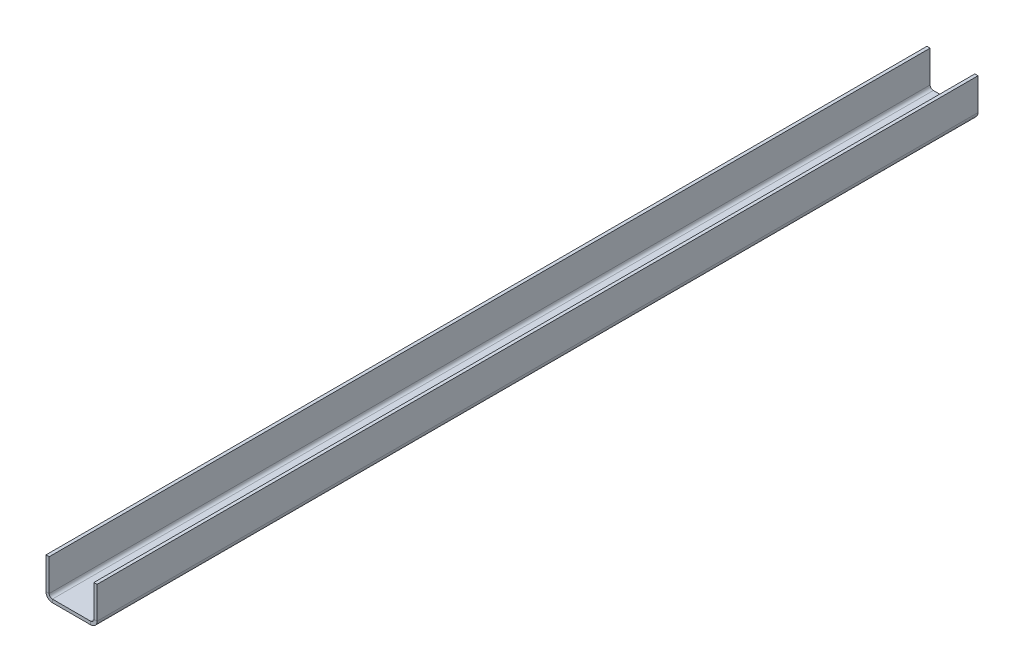
ISO-10303-21;
HEADER;
FILE_DESCRIPTION(('STEP AP214'),'2;1');
FILE_NAME('part.step','',(''),(''),'','','');
FILE_SCHEMA(('AUTOMOTIVE_DESIGN { 1 0 10303 214 1 1 1 1 }'));
ENDSEC;
DATA;
#1=APPLICATION_CONTEXT('core data for automotive mechanical design processes');
#2=APPLICATION_PROTOCOL_DEFINITION('international standard','automotive_design',2000,#1);
#3=PRODUCT_CONTEXT('',#1,'mechanical');
#4=PRODUCT('Part','Part','',(#3));
#5=PRODUCT_RELATED_PRODUCT_CATEGORY('part','',(#4));
#6=PRODUCT_DEFINITION_FORMATION('','',#4);
#7=PRODUCT_DEFINITION_CONTEXT('part definition',#1,'design');
#8=PRODUCT_DEFINITION('design','',#6,#7);
#9=PRODUCT_DEFINITION_SHAPE('','',#8);
#10=(LENGTH_UNIT() NAMED_UNIT(*) SI_UNIT(.MILLI.,.METRE.));
#11=(NAMED_UNIT(*) PLANE_ANGLE_UNIT() SI_UNIT($,.RADIAN.));
#12=(NAMED_UNIT(*) SI_UNIT($,.STERADIAN.) SOLID_ANGLE_UNIT());
#13=UNCERTAINTY_MEASURE_WITH_UNIT(LENGTH_MEASURE(1.E-05),#10,'distance_accuracy_value','');
#14=(GEOMETRIC_REPRESENTATION_CONTEXT(3) GLOBAL_UNCERTAINTY_ASSIGNED_CONTEXT((#13)) GLOBAL_UNIT_ASSIGNED_CONTEXT((#10,
#11,#12)) REPRESENTATION_CONTEXT('',''));
#15=CARTESIAN_POINT('',(0.,0.,0.));
#16=DIRECTION('',(0.,0.,1.));
#17=DIRECTION('',(1.,0.,0.));
#18=AXIS2_PLACEMENT_3D('',#15,#16,#17);
#19=CARTESIAN_POINT('',(0.,6.35,876.3));
#20=DIRECTION('',(0.,0.,1.));
#21=DIRECTION('',(1.,0.,0.));
#22=AXIS2_PLACEMENT_3D('',#19,#20,#21);
#23=PLANE('',#22);
#24=DIRECTION('',(1.,0.,0.));
#25=VECTOR('',#24,1.);
#26=CARTESIAN_POINT('',(0.,6.35,876.3));
#27=LINE('',#26,#25);
#28=CARTESIAN_POINT('',(0.,6.35,876.3));
#29=VERTEX_POINT('',#28);
#30=CARTESIAN_POINT('',(3.175,6.35,876.3));
#31=VERTEX_POINT('',#30);
#32=EDGE_CURVE('E11',#29,#31,#27,.T.);
#33=ORIENTED_EDGE('',*,*,#32,.F.);
#34=CARTESIAN_POINT('',(6.35,6.35,876.3));
#35=DIRECTION('',(0.,0.,-1.));
#36=DIRECTION('',(-1.,0.,0.));
#37=AXIS2_PLACEMENT_3D('',#34,#35,#36);
#38=CIRCLE('',#37,6.35);
#39=CARTESIAN_POINT('',(6.35,0.,876.3));
#40=VERTEX_POINT('',#39);
#41=EDGE_CURVE('E147',#29,#40,#38,.F.);
#42=ORIENTED_EDGE('',*,*,#41,.T.);
#43=DIRECTION('',(0.,-1.,0.));
#44=VECTOR('',#43,1.);
#45=CARTESIAN_POINT('',(6.35,3.175,876.3));
#46=LINE('',#45,#44);
#47=CARTESIAN_POINT('',(6.35,3.175,876.3));
#48=VERTEX_POINT('',#47);
#49=EDGE_CURVE('E45',#48,#40,#46,.T.);
#50=ORIENTED_EDGE('',*,*,#49,.F.);
#51=CARTESIAN_POINT('',(6.35,6.35,876.3));
#52=DIRECTION('',(0.,0.,1.));
#53=DIRECTION('',(1.,0.,0.));
#54=AXIS2_PLACEMENT_3D('',#51,#52,#53);
#55=CIRCLE('',#54,3.175);
#56=EDGE_CURVE('E241',#31,#48,#55,.T.);
#57=ORIENTED_EDGE('',*,*,#56,.F.);
#58=EDGE_LOOP('',(#33,#42,#50,#57));
#59=FACE_BOUND('',#58,.T.);
#60=ADVANCED_FACE('F37',(#59),#23,.T.);
#61=CARTESIAN_POINT('',(6.35,3.175,876.3));
#62=DIRECTION('',(0.,0.,1.));
#63=DIRECTION('',(1.,0.,0.));
#64=AXIS2_PLACEMENT_3D('',#61,#62,#63);
#65=PLANE('',#64);
#66=DIRECTION('',(0.,-1.,0.));
#67=VECTOR('',#66,1.);
#68=CARTESIAN_POINT('',(0.,0.,876.3));
#69=LINE('',#68,#67);
#70=CARTESIAN_POINT('',(0.,38.1,876.3));
#71=VERTEX_POINT('',#70);
#72=EDGE_CURVE('E152',#71,#29,#69,.T.);
#73=ORIENTED_EDGE('',*,*,#72,.T.);
#74=ORIENTED_EDGE('',*,*,#32,.T.);
#75=DIRECTION('',(0.,1.,0.));
#76=VECTOR('',#75,1.);
#77=CARTESIAN_POINT('',(3.175,0.,876.3));
#78=LINE('',#77,#76);
#79=CARTESIAN_POINT('',(3.175,38.1,876.3));
#80=VERTEX_POINT('',#79);
#81=EDGE_CURVE('E254',#80,#31,#78,.F.);
#82=ORIENTED_EDGE('',*,*,#81,.F.);
#83=DIRECTION('',(1.,0.,0.));
#84=VECTOR('',#83,1.);
#85=CARTESIAN_POINT('',(0.,38.1,876.3));
#86=LINE('',#85,#84);
#87=EDGE_CURVE('E256',#71,#80,#86,.T.);
#88=ORIENTED_EDGE('',*,*,#87,.F.);
#89=EDGE_LOOP('',(#73,#74,#82,#88));
#90=FACE_BOUND('',#89,.T.);
#91=ADVANCED_FACE('F267',(#90),#65,.T.);
#92=CARTESIAN_POINT('',(6.35,0.,0.));
#93=DIRECTION('',(0.,0.,-1.));
#94=DIRECTION('',(-1.,0.,0.));
#95=AXIS2_PLACEMENT_3D('',#92,#93,#94);
#96=PLANE('',#95);
#97=DIRECTION('',(0.,1.,0.));
#98=VECTOR('',#97,1.);
#99=CARTESIAN_POINT('',(6.35,0.,0.));
#100=LINE('',#99,#98);
#101=CARTESIAN_POINT('',(6.35,0.,0.));
#102=VERTEX_POINT('',#101);
#103=CARTESIAN_POINT('',(6.35,3.175,0.));
#104=VERTEX_POINT('',#103);
#105=EDGE_CURVE('E145',#102,#104,#100,.T.);
#106=ORIENTED_EDGE('',*,*,#105,.F.);
#107=CARTESIAN_POINT('',(6.35,6.35,0.));
#108=DIRECTION('',(0.,0.,-1.));
#109=DIRECTION('',(-1.,0.,0.));
#110=AXIS2_PLACEMENT_3D('',#107,#108,#109);
#111=CIRCLE('',#110,6.35);
#112=CARTESIAN_POINT('',(0.,6.35,0.));
#113=VERTEX_POINT('',#112);
#114=EDGE_CURVE('E159',#113,#102,#111,.F.);
#115=ORIENTED_EDGE('',*,*,#114,.F.);
#116=DIRECTION('',(-1.,0.,0.));
#117=VECTOR('',#116,1.);
#118=CARTESIAN_POINT('',(3.175,6.35,0.));
#119=LINE('',#118,#117);
#120=CARTESIAN_POINT('',(3.175,6.35,0.));
#121=VERTEX_POINT('',#120);
#122=EDGE_CURVE('E232',#121,#113,#119,.T.);
#123=ORIENTED_EDGE('',*,*,#122,.F.);
#124=CARTESIAN_POINT('',(6.35,6.35,0.));
#125=DIRECTION('',(0.,0.,1.));
#126=DIRECTION('',(1.,0.,0.));
#127=AXIS2_PLACEMENT_3D('',#124,#125,#126);
#128=CIRCLE('',#127,3.175);
#129=EDGE_CURVE('E186',#121,#104,#128,.T.);
#130=ORIENTED_EDGE('',*,*,#129,.T.);
#131=EDGE_LOOP('',(#106,#115,#123,#130));
#132=FACE_BOUND('',#131,.T.);
#133=ADVANCED_FACE('F246',(#132),#96,.T.);
#134=CARTESIAN_POINT('',(3.175,6.35,0.));
#135=DIRECTION('',(0.,0.,-1.));
#136=DIRECTION('',(-1.,0.,0.));
#137=AXIS2_PLACEMENT_3D('',#134,#135,#136);
#138=PLANE('',#137);
#139=DIRECTION('',(1.,0.,0.));
#140=VECTOR('',#139,1.);
#141=CARTESIAN_POINT('',(0.,0.,0.));
#142=LINE('',#141,#140);
#143=CARTESIAN_POINT('',(44.45,0.,0.));
#144=VERTEX_POINT('',#143);
#145=EDGE_CURVE('E199',#102,#144,#142,.T.);
#146=ORIENTED_EDGE('',*,*,#145,.F.);
#147=ORIENTED_EDGE('',*,*,#105,.T.);
#148=DIRECTION('',(1.,0.,0.));
#149=VECTOR('',#148,1.);
#150=CARTESIAN_POINT('',(0.,3.175,0.));
#151=LINE('',#150,#149);
#152=CARTESIAN_POINT('',(44.45,3.175,0.));
#153=VERTEX_POINT('',#152);
#154=EDGE_CURVE('E184',#104,#153,#151,.T.);
#155=ORIENTED_EDGE('',*,*,#154,.T.);
#156=DIRECTION('',(0.,-1.,0.));
#157=VECTOR('',#156,1.);
#158=CARTESIAN_POINT('',(44.45,3.175,0.));
#159=LINE('',#158,#157);
#160=EDGE_CURVE('E94',#153,#144,#159,.T.);
#161=ORIENTED_EDGE('',*,*,#160,.T.);
#162=EDGE_LOOP('',(#146,#147,#155,#161));
#163=FACE_BOUND('',#162,.T.);
#164=ADVANCED_FACE('F234',(#163),#138,.T.);
#165=CARTESIAN_POINT('',(44.45,0.,876.3));
#166=DIRECTION('',(0.,0.,1.));
#167=DIRECTION('',(1.,0.,0.));
#168=AXIS2_PLACEMENT_3D('',#165,#166,#167);
#169=PLANE('',#168);
#170=DIRECTION('',(0.,1.,0.));
#171=VECTOR('',#170,1.);
#172=CARTESIAN_POINT('',(44.45,0.,876.3));
#173=LINE('',#172,#171);
#174=CARTESIAN_POINT('',(44.45,0.,876.3));
#175=VERTEX_POINT('',#174);
#176=CARTESIAN_POINT('',(44.45,3.175,876.3));
#177=VERTEX_POINT('',#176);
#178=EDGE_CURVE('E230',#175,#177,#173,.T.);
#179=ORIENTED_EDGE('',*,*,#178,.F.);
#180=CARTESIAN_POINT('',(44.45,6.35,876.3));
#181=DIRECTION('',(0.,0.,-1.));
#182=DIRECTION('',(-1.,0.,0.));
#183=AXIS2_PLACEMENT_3D('',#180,#181,#182);
#184=CIRCLE('',#183,6.35);
#185=CARTESIAN_POINT('',(50.8,6.35,876.3));
#186=VERTEX_POINT('',#185);
#187=EDGE_CURVE('E167',#175,#186,#184,.F.);
#188=ORIENTED_EDGE('',*,*,#187,.T.);
#189=DIRECTION('',(1.,0.,0.));
#190=VECTOR('',#189,1.);
#191=CARTESIAN_POINT('',(47.625,6.35,876.3));
#192=LINE('',#191,#190);
#193=CARTESIAN_POINT('',(47.625,6.35,876.3));
#194=VERTEX_POINT('',#193);
#195=EDGE_CURVE('E53',#194,#186,#192,.T.);
#196=ORIENTED_EDGE('',*,*,#195,.F.);
#197=CARTESIAN_POINT('',(44.45,6.35,876.3));
#198=DIRECTION('',(0.,0.,1.));
#199=DIRECTION('',(1.,0.,0.));
#200=AXIS2_PLACEMENT_3D('',#197,#198,#199);
#201=CIRCLE('',#200,3.175);
#202=EDGE_CURVE('E258',#177,#194,#201,.T.);
#203=ORIENTED_EDGE('',*,*,#202,.F.);
#204=EDGE_LOOP('',(#179,#188,#196,#203));
#205=FACE_BOUND('',#204,.T.);
#206=ADVANCED_FACE('F293',(#205),#169,.T.);
#207=CARTESIAN_POINT('',(47.625,6.35,876.3));
#208=DIRECTION('',(0.,0.,1.));
#209=DIRECTION('',(1.,0.,0.));
#210=AXIS2_PLACEMENT_3D('',#207,#208,#209);
#211=PLANE('',#210);
#212=DIRECTION('',(1.,0.,0.));
#213=VECTOR('',#212,1.);
#214=CARTESIAN_POINT('',(0.,0.,876.3));
#215=LINE('',#214,#213);
#216=EDGE_CURVE('E137',#40,#175,#215,.T.);
#217=ORIENTED_EDGE('',*,*,#216,.T.);
#218=ORIENTED_EDGE('',*,*,#178,.T.);
#219=DIRECTION('',(1.,0.,0.));
#220=VECTOR('',#219,1.);
#221=CARTESIAN_POINT('',(0.,3.175,876.3));
#222=LINE('',#221,#220);
#223=EDGE_CURVE('E140',#48,#177,#222,.T.);
#224=ORIENTED_EDGE('',*,*,#223,.F.);
#225=ORIENTED_EDGE('',*,*,#49,.T.);
#226=EDGE_LOOP('',(#217,#218,#224,#225));
#227=FACE_BOUND('',#226,.T.);
#228=ADVANCED_FACE('F135',(#227),#211,.T.);
#229=CARTESIAN_POINT('',(50.8,6.35,0.));
#230=DIRECTION('',(0.,0.,-1.));
#231=DIRECTION('',(-1.,0.,0.));
#232=AXIS2_PLACEMENT_3D('',#229,#230,#231);
#233=PLANE('',#232);
#234=DIRECTION('',(-1.,0.,0.));
#235=VECTOR('',#234,1.);
#236=CARTESIAN_POINT('',(50.8,6.35,0.));
#237=LINE('',#236,#235);
#238=CARTESIAN_POINT('',(50.8,6.35,0.));
#239=VERTEX_POINT('',#238);
#240=CARTESIAN_POINT('',(47.625,6.35,0.));
#241=VERTEX_POINT('',#240);
#242=EDGE_CURVE('E101',#239,#241,#237,.T.);
#243=ORIENTED_EDGE('',*,*,#242,.F.);
#244=CARTESIAN_POINT('',(44.45,6.35,0.));
#245=DIRECTION('',(0.,0.,-1.));
#246=DIRECTION('',(-1.,0.,0.));
#247=AXIS2_PLACEMENT_3D('',#244,#245,#246);
#248=CIRCLE('',#247,6.35);
#249=EDGE_CURVE('E201',#144,#239,#248,.F.);
#250=ORIENTED_EDGE('',*,*,#249,.F.);
#251=ORIENTED_EDGE('',*,*,#160,.F.);
#252=CARTESIAN_POINT('',(44.45,6.35,0.));
#253=DIRECTION('',(0.,0.,1.));
#254=DIRECTION('',(1.,0.,0.));
#255=AXIS2_PLACEMENT_3D('',#252,#253,#254);
#256=CIRCLE('',#255,3.175);
#257=EDGE_CURVE('E182',#153,#241,#256,.T.);
#258=ORIENTED_EDGE('',*,*,#257,.T.);
#259=EDGE_LOOP('',(#243,#250,#251,#258));
#260=FACE_BOUND('',#259,.T.);
#261=ADVANCED_FACE('F299',(#260),#233,.T.);
#262=CARTESIAN_POINT('',(44.45,3.175,0.));
#263=DIRECTION('',(0.,0.,-1.));
#264=DIRECTION('',(-1.,0.,0.));
#265=AXIS2_PLACEMENT_3D('',#262,#263,#264);
#266=PLANE('',#265);
#267=DIRECTION('',(0.,1.,0.));
#268=VECTOR('',#267,1.);
#269=CARTESIAN_POINT('',(50.8,0.,0.));
#270=LINE('',#269,#268);
#271=CARTESIAN_POINT('',(50.8,38.1,0.));
#272=VERTEX_POINT('',#271);
#273=EDGE_CURVE('E173',#239,#272,#270,.T.);
#274=ORIENTED_EDGE('',*,*,#273,.F.);
#275=ORIENTED_EDGE('',*,*,#242,.T.);
#276=DIRECTION('',(0.,1.,0.));
#277=VECTOR('',#276,1.);
#278=CARTESIAN_POINT('',(47.625,0.,0.));
#279=LINE('',#278,#277);
#280=CARTESIAN_POINT('',(47.625,38.1,0.));
#281=VERTEX_POINT('',#280);
#282=EDGE_CURVE('E179',#241,#281,#279,.T.);
#283=ORIENTED_EDGE('',*,*,#282,.T.);
#284=DIRECTION('',(1.,0.,0.));
#285=VECTOR('',#284,1.);
#286=CARTESIAN_POINT('',(47.625,38.1,0.));
#287=LINE('',#286,#285);
#288=EDGE_CURVE('E176',#281,#272,#287,.T.);
#289=ORIENTED_EDGE('',*,*,#288,.T.);
#290=EDGE_LOOP('',(#274,#275,#283,#289));
#291=FACE_BOUND('',#290,.T.);
#292=ADVANCED_FACE('F302',(#291),#266,.T.);
#293=CARTESIAN_POINT('',(50.8,0.,876.3));
#294=DIRECTION('',(-1.,0.,0.));
#295=DIRECTION('',(0.,0.,1.));
#296=AXIS2_PLACEMENT_3D('',#293,#294,#295);
#297=PLANE('',#296);
#298=ORIENTED_EDGE('',*,*,#273,.T.);
#299=DIRECTION('',(0.,0.,-1.));
#300=VECTOR('',#299,1.);
#301=CARTESIAN_POINT('',(50.8,38.1,876.3));
#302=LINE('',#301,#300);
#303=CARTESIAN_POINT('',(50.8,38.1,876.3));
#304=VERTEX_POINT('',#303);
#305=EDGE_CURVE('E225',#304,#272,#302,.T.);
#306=ORIENTED_EDGE('',*,*,#305,.F.);
#307=DIRECTION('',(0.,1.,0.));
#308=VECTOR('',#307,1.);
#309=CARTESIAN_POINT('',(50.8,0.,876.3));
#310=LINE('',#309,#308);
#311=EDGE_CURVE('E107',#186,#304,#310,.T.);
#312=ORIENTED_EDGE('',*,*,#311,.F.);
#313=DIRECTION('',(0.,0.,-1.));
#314=VECTOR('',#313,1.);
#315=CARTESIAN_POINT('',(50.8,6.35,876.3));
#316=LINE('',#315,#314);
#317=EDGE_CURVE('E169',#186,#239,#316,.T.);
#318=ORIENTED_EDGE('',*,*,#317,.T.);
#319=EDGE_LOOP('',(#298,#306,#312,#318));
#320=FACE_BOUND('',#319,.T.);
#321=ADVANCED_FACE('F305',(#320),#297,.F.);
#322=CARTESIAN_POINT('',(47.625,38.1,876.3));
#323=DIRECTION('',(0.,1.,0.));
#324=DIRECTION('',(0.,0.,1.));
#325=AXIS2_PLACEMENT_3D('',#322,#323,#324);
#326=PLANE('',#325);
#327=ORIENTED_EDGE('',*,*,#288,.F.);
#328=DIRECTION('',(0.,0.,-1.));
#329=VECTOR('',#328,1.);
#330=CARTESIAN_POINT('',(47.625,38.1,876.3));
#331=LINE('',#330,#329);
#332=CARTESIAN_POINT('',(47.625,38.1,876.3));
#333=VERTEX_POINT('',#332);
#334=EDGE_CURVE('E223',#333,#281,#331,.T.);
#335=ORIENTED_EDGE('',*,*,#334,.F.);
#336=DIRECTION('',(1.,0.,0.));
#337=VECTOR('',#336,1.);
#338=CARTESIAN_POINT('',(47.625,38.1,876.3));
#339=LINE('',#338,#337);
#340=EDGE_CURVE('E513',#333,#304,#339,.T.);
#341=ORIENTED_EDGE('',*,*,#340,.T.);
#342=ORIENTED_EDGE('',*,*,#305,.T.);
#343=EDGE_LOOP('',(#327,#335,#341,#342));
#344=FACE_BOUND('',#343,.T.);
#345=ADVANCED_FACE('F309',(#344),#326,.T.);
#346=CARTESIAN_POINT('',(47.625,0.,876.3));
#347=DIRECTION('',(-1.,0.,0.));
#348=DIRECTION('',(0.,0.,1.));
#349=AXIS2_PLACEMENT_3D('',#346,#347,#348);
#350=PLANE('',#349);
#351=ORIENTED_EDGE('',*,*,#282,.F.);
#352=DIRECTION('',(0.,0.,-1.));
#353=VECTOR('',#352,1.);
#354=CARTESIAN_POINT('',(47.625,6.35,876.3));
#355=LINE('',#354,#353);
#356=EDGE_CURVE('E220',#194,#241,#355,.T.);
#357=ORIENTED_EDGE('',*,*,#356,.F.);
#358=DIRECTION('',(0.,1.,0.));
#359=VECTOR('',#358,1.);
#360=CARTESIAN_POINT('',(47.625,0.,876.3));
#361=LINE('',#360,#359);
#362=EDGE_CURVE('E515',#194,#333,#361,.T.);
#363=ORIENTED_EDGE('',*,*,#362,.T.);
#364=ORIENTED_EDGE('',*,*,#334,.T.);
#365=EDGE_LOOP('',(#351,#357,#363,#364));
#366=FACE_BOUND('',#365,.T.);
#367=ADVANCED_FACE('F313',(#366),#350,.T.);
#368=CARTESIAN_POINT('',(44.45,6.35,876.3));
#369=DIRECTION('',(0.,0.,-1.));
#370=DIRECTION('',(-1.,0.,0.));
#371=AXIS2_PLACEMENT_3D('',#368,#369,#370);
#372=CYLINDRICAL_SURFACE('',#371,3.175);
#373=ORIENTED_EDGE('',*,*,#257,.F.);
#374=DIRECTION('',(0.,0.,-1.));
#375=VECTOR('',#374,1.);
#376=CARTESIAN_POINT('',(44.45,3.175,876.3));
#377=LINE('',#376,#375);
#378=EDGE_CURVE('E217',#177,#153,#377,.T.);
#379=ORIENTED_EDGE('',*,*,#378,.F.);
#380=ORIENTED_EDGE('',*,*,#202,.T.);
#381=ORIENTED_EDGE('',*,*,#356,.T.);
#382=EDGE_LOOP('',(#373,#379,#380,#381));
#383=FACE_BOUND('',#382,.T.);
#384=ADVANCED_FACE('F317',(#383),#372,.F.);
#385=CARTESIAN_POINT('',(0.,3.175,876.3));
#386=DIRECTION('',(0.,1.,0.));
#387=DIRECTION('',(0.,0.,1.));
#388=AXIS2_PLACEMENT_3D('',#385,#386,#387);
#389=PLANE('',#388);
#390=ORIENTED_EDGE('',*,*,#154,.F.);
#391=DIRECTION('',(0.,0.,-1.));
#392=VECTOR('',#391,1.);
#393=CARTESIAN_POINT('',(6.35,3.175,876.3));
#394=LINE('',#393,#392);
#395=EDGE_CURVE('E214',#48,#104,#394,.T.);
#396=ORIENTED_EDGE('',*,*,#395,.F.);
#397=ORIENTED_EDGE('',*,*,#223,.T.);
#398=ORIENTED_EDGE('',*,*,#378,.T.);
#399=EDGE_LOOP('',(#390,#396,#397,#398));
#400=FACE_BOUND('',#399,.T.);
#401=ADVANCED_FACE('F243',(#400),#389,.T.);
#402=CARTESIAN_POINT('',(6.35,6.35,876.3));
#403=DIRECTION('',(0.,0.,-1.));
#404=DIRECTION('',(-1.,0.,0.));
#405=AXIS2_PLACEMENT_3D('',#402,#403,#404);
#406=CYLINDRICAL_SURFACE('',#405,3.175);
#407=ORIENTED_EDGE('',*,*,#129,.F.);
#408=DIRECTION('',(0.,0.,-1.));
#409=VECTOR('',#408,1.);
#410=CARTESIAN_POINT('',(3.175,6.35,876.3));
#411=LINE('',#410,#409);
#412=EDGE_CURVE('E211',#31,#121,#411,.T.);
#413=ORIENTED_EDGE('',*,*,#412,.F.);
#414=ORIENTED_EDGE('',*,*,#56,.T.);
#415=ORIENTED_EDGE('',*,*,#395,.T.);
#416=EDGE_LOOP('',(#407,#413,#414,#415));
#417=FACE_BOUND('',#416,.T.);
#418=ADVANCED_FACE('F239',(#417),#406,.F.);
#419=CARTESIAN_POINT('',(3.175,0.,876.3));
#420=DIRECTION('',(1.,0.,0.));
#421=DIRECTION('',(0.,0.,-1.));
#422=AXIS2_PLACEMENT_3D('',#419,#420,#421);
#423=PLANE('',#422);
#424=DIRECTION('',(0.,1.,0.));
#425=VECTOR('',#424,1.);
#426=CARTESIAN_POINT('',(3.175,0.,0.));
#427=LINE('',#426,#425);
#428=CARTESIAN_POINT('',(3.175,38.1,0.));
#429=VERTEX_POINT('',#428);
#430=EDGE_CURVE('E189',#429,#121,#427,.F.);
#431=ORIENTED_EDGE('',*,*,#430,.F.);
#432=DIRECTION('',(0.,0.,-1.));
#433=VECTOR('',#432,1.);
#434=CARTESIAN_POINT('',(3.175,38.1,876.3));
#435=LINE('',#434,#433);
#436=EDGE_CURVE('E209',#80,#429,#435,.T.);
#437=ORIENTED_EDGE('',*,*,#436,.F.);
#438=ORIENTED_EDGE('',*,*,#81,.T.);
#439=ORIENTED_EDGE('',*,*,#412,.T.);
#440=EDGE_LOOP('',(#431,#437,#438,#439));
#441=FACE_BOUND('',#440,.T.);
#442=ADVANCED_FACE('F252',(#441),#423,.T.);
#443=CARTESIAN_POINT('',(0.,38.1,876.3));
#444=DIRECTION('',(0.,1.,0.));
#445=DIRECTION('',(0.,0.,1.));
#446=AXIS2_PLACEMENT_3D('',#443,#444,#445);
#447=PLANE('',#446);
#448=DIRECTION('',(1.,0.,0.));
#449=VECTOR('',#448,1.);
#450=CARTESIAN_POINT('',(0.,38.1,0.));
#451=LINE('',#450,#449);
#452=CARTESIAN_POINT('',(0.,38.1,0.));
#453=VERTEX_POINT('',#452);
#454=EDGE_CURVE('E192',#453,#429,#451,.T.);
#455=ORIENTED_EDGE('',*,*,#454,.F.);
#456=DIRECTION('',(0.,0.,-1.));
#457=VECTOR('',#456,1.);
#458=CARTESIAN_POINT('',(0.,38.1,876.3));
#459=LINE('',#458,#457);
#460=EDGE_CURVE('E207',#71,#453,#459,.T.);
#461=ORIENTED_EDGE('',*,*,#460,.F.);
#462=ORIENTED_EDGE('',*,*,#87,.T.);
#463=ORIENTED_EDGE('',*,*,#436,.T.);
#464=EDGE_LOOP('',(#455,#461,#462,#463));
#465=FACE_BOUND('',#464,.T.);
#466=ADVANCED_FACE('F273',(#465),#447,.T.);
#467=CARTESIAN_POINT('',(0.,0.,876.3));
#468=DIRECTION('',(1.,0.,0.));
#469=DIRECTION('',(0.,0.,-1.));
#470=AXIS2_PLACEMENT_3D('',#467,#468,#469);
#471=PLANE('',#470);
#472=DIRECTION('',(0.,-1.,0.));
#473=VECTOR('',#472,1.);
#474=CARTESIAN_POINT('',(0.,0.,0.));
#475=LINE('',#474,#473);
#476=EDGE_CURVE('E195',#453,#113,#475,.T.);
#477=ORIENTED_EDGE('',*,*,#476,.T.);
#478=DIRECTION('',(0.,0.,-1.));
#479=VECTOR('',#478,1.);
#480=CARTESIAN_POINT('',(0.,6.35,876.3));
#481=LINE('',#480,#479);
#482=EDGE_CURVE('E161',#29,#113,#481,.T.);
#483=ORIENTED_EDGE('',*,*,#482,.F.);
#484=ORIENTED_EDGE('',*,*,#72,.F.);
#485=ORIENTED_EDGE('',*,*,#460,.T.);
#486=EDGE_LOOP('',(#477,#483,#484,#485));
#487=FACE_BOUND('',#486,.T.);
#488=ADVANCED_FACE('F269',(#487),#471,.F.);
#489=CARTESIAN_POINT('',(6.35,6.35,876.3));
#490=DIRECTION('',(0.,0.,-1.));
#491=DIRECTION('',(-1.,0.,0.));
#492=AXIS2_PLACEMENT_3D('',#489,#490,#491);
#493=CYLINDRICAL_SURFACE('',#492,6.35);
#494=ORIENTED_EDGE('',*,*,#114,.T.);
#495=DIRECTION('',(0.,0.,-1.));
#496=VECTOR('',#495,1.);
#497=CARTESIAN_POINT('',(6.35,0.,876.3));
#498=LINE('',#497,#496);
#499=EDGE_CURVE('E156',#40,#102,#498,.T.);
#500=ORIENTED_EDGE('',*,*,#499,.F.);
#501=ORIENTED_EDGE('',*,*,#41,.F.);
#502=ORIENTED_EDGE('',*,*,#482,.T.);
#503=EDGE_LOOP('',(#494,#500,#501,#502));
#504=FACE_BOUND('',#503,.T.);
#505=ADVANCED_FACE('F157',(#504),#493,.T.);
#506=CARTESIAN_POINT('',(0.,0.,876.3));
#507=DIRECTION('',(0.,1.,0.));
#508=DIRECTION('',(0.,0.,1.));
#509=AXIS2_PLACEMENT_3D('',#506,#507,#508);
#510=PLANE('',#509);
#511=ORIENTED_EDGE('',*,*,#145,.T.);
#512=DIRECTION('',(0.,0.,-1.));
#513=VECTOR('',#512,1.);
#514=CARTESIAN_POINT('',(44.45,0.,876.3));
#515=LINE('',#514,#513);
#516=EDGE_CURVE('E162',#175,#144,#515,.T.);
#517=ORIENTED_EDGE('',*,*,#516,.F.);
#518=ORIENTED_EDGE('',*,*,#216,.F.);
#519=ORIENTED_EDGE('',*,*,#499,.T.);
#520=EDGE_LOOP('',(#511,#517,#518,#519));
#521=FACE_BOUND('',#520,.T.);
#522=ADVANCED_FACE('F164',(#521),#510,.F.);
#523=CARTESIAN_POINT('',(44.45,6.35,876.3));
#524=DIRECTION('',(0.,0.,-1.));
#525=DIRECTION('',(-1.,0.,0.));
#526=AXIS2_PLACEMENT_3D('',#523,#524,#525);
#527=CYLINDRICAL_SURFACE('',#526,6.35);
#528=ORIENTED_EDGE('',*,*,#249,.T.);
#529=ORIENTED_EDGE('',*,*,#317,.F.);
#530=ORIENTED_EDGE('',*,*,#187,.F.);
#531=ORIENTED_EDGE('',*,*,#516,.T.);
#532=EDGE_LOOP('',(#528,#529,#530,#531));
#533=FACE_BOUND('',#532,.T.);
#534=ADVANCED_FACE('F364',(#533),#527,.T.);
#535=CARTESIAN_POINT('',(44.45,6.35,876.3));
#536=DIRECTION('',(0.,0.,1.));
#537=DIRECTION('',(1.,0.,0.));
#538=AXIS2_PLACEMENT_3D('',#535,#536,#537);
#539=PLANE('',#538);
#540=ORIENTED_EDGE('',*,*,#311,.T.);
#541=ORIENTED_EDGE('',*,*,#340,.F.);
#542=ORIENTED_EDGE('',*,*,#362,.F.);
#543=ORIENTED_EDGE('',*,*,#195,.T.);
#544=EDGE_LOOP('',(#540,#541,#542,#543));
#545=FACE_BOUND('',#544,.T.);
#546=ADVANCED_FACE('F374',(#545),#539,.T.);
#547=CARTESIAN_POINT('',(44.45,6.35,0.));
#548=DIRECTION('',(0.,0.,1.));
#549=DIRECTION('',(1.,0.,0.));
#550=AXIS2_PLACEMENT_3D('',#547,#548,#549);
#551=PLANE('',#550);
#552=ORIENTED_EDGE('',*,*,#430,.T.);
#553=ORIENTED_EDGE('',*,*,#122,.T.);
#554=ORIENTED_EDGE('',*,*,#476,.F.);
#555=ORIENTED_EDGE('',*,*,#454,.T.);
#556=EDGE_LOOP('',(#552,#553,#554,#555));
#557=FACE_BOUND('',#556,.T.);
#558=ADVANCED_FACE('F271',(#557),#551,.F.);
#559=CLOSED_SHELL('',(#60,#91,#133,#164,#206,#228,#261,#292,#321,#345,#367,#384,#401,#418,#442,
#466,#488,#505,#522,#534,#546,#558));
#560=MANIFOLD_SOLID_BREP('B2',#559);
#561=ADVANCED_BREP_SHAPE_REPRESENTATION('',(#18,#560),#14);
#562=SHAPE_DEFINITION_REPRESENTATION(#9,#561);
ENDSEC;
END-ISO-10303-21;
